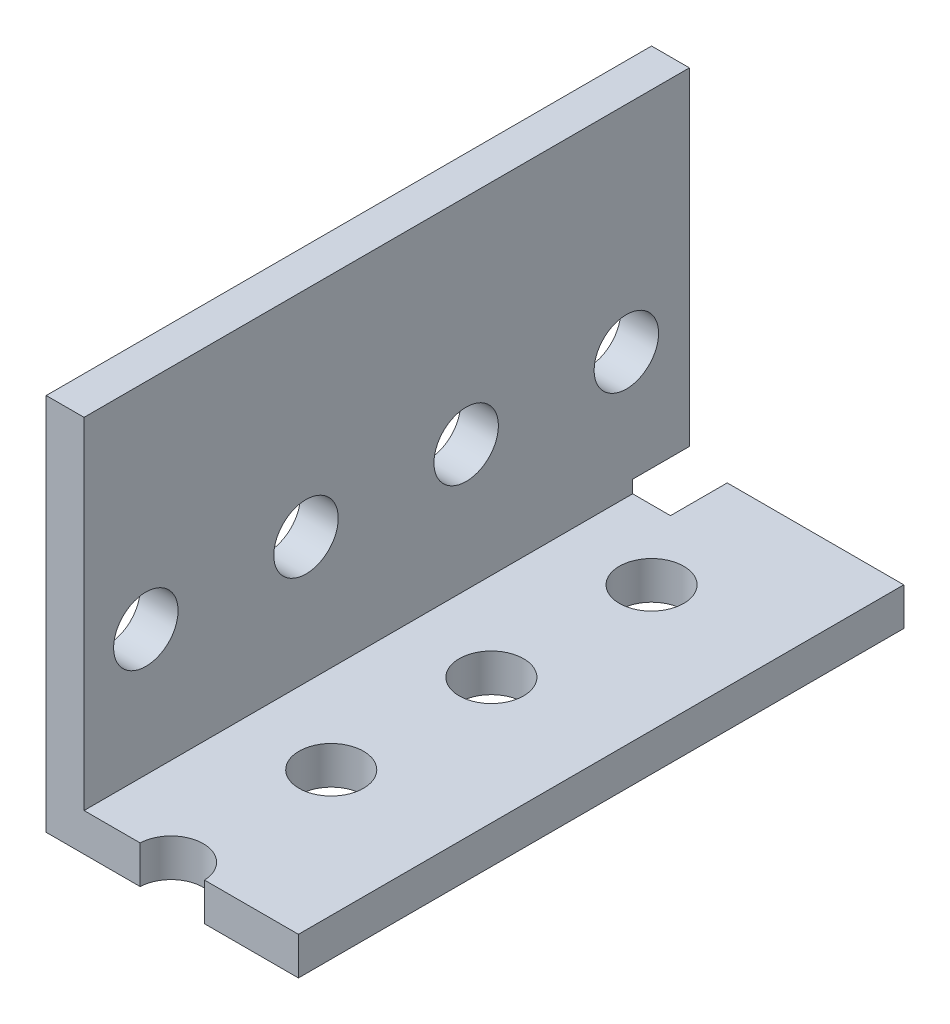
ISO-10303-21;
HEADER;
FILE_DESCRIPTION(('STEP AP214'),'2;1');
FILE_NAME('part.step','',(''),(''),'','','');
FILE_SCHEMA(('AUTOMOTIVE_DESIGN { 1 0 10303 214 1 1 1 1 }'));
ENDSEC;
DATA;
#1=APPLICATION_CONTEXT('core data for automotive mechanical design processes');
#2=APPLICATION_PROTOCOL_DEFINITION('international standard','automotive_design',2000,#1);
#3=PRODUCT_CONTEXT('',#1,'mechanical');
#4=PRODUCT('Part','Part','',(#3));
#5=PRODUCT_RELATED_PRODUCT_CATEGORY('part','',(#4));
#6=PRODUCT_DEFINITION_FORMATION('','',#4);
#7=PRODUCT_DEFINITION_CONTEXT('part definition',#1,'design');
#8=PRODUCT_DEFINITION('design','',#6,#7);
#9=PRODUCT_DEFINITION_SHAPE('','',#8);
#10=(LENGTH_UNIT() NAMED_UNIT(*) SI_UNIT(.MILLI.,.METRE.));
#11=(NAMED_UNIT(*) PLANE_ANGLE_UNIT() SI_UNIT($,.RADIAN.));
#12=(NAMED_UNIT(*) SI_UNIT($,.STERADIAN.) SOLID_ANGLE_UNIT());
#13=UNCERTAINTY_MEASURE_WITH_UNIT(LENGTH_MEASURE(1.E-05),#10,'distance_accuracy_value','');
#14=(GEOMETRIC_REPRESENTATION_CONTEXT(3) GLOBAL_UNCERTAINTY_ASSIGNED_CONTEXT((#13)) GLOBAL_UNIT_ASSIGNED_CONTEXT((#10,
#11,#12)) REPRESENTATION_CONTEXT('',''));
#15=CARTESIAN_POINT('',(0.,0.,0.));
#16=DIRECTION('',(0.,0.,1.));
#17=DIRECTION('',(1.,0.,0.));
#18=AXIS2_PLACEMENT_3D('',#15,#16,#17);
#19=CARTESIAN_POINT('',(0.,0.,0.));
#20=DIRECTION('',(0.,0.,1.));
#21=DIRECTION('',(1.,0.,0.));
#22=AXIS2_PLACEMENT_3D('',#19,#20,#21);
#23=PLANE('',#22);
#24=DIRECTION('',(1.,0.,0.));
#25=VECTOR('',#24,1.);
#26=CARTESIAN_POINT('',(0.,-15.,0.));
#27=LINE('',#26,#25);
#28=CARTESIAN_POINT('',(4.5,-15.,0.));
#29=VERTEX_POINT('',#28);
#30=CARTESIAN_POINT('',(18.5,-15.,0.));
#31=VERTEX_POINT('',#30);
#32=EDGE_CURVE('E221',#29,#31,#27,.T.);
#33=ORIENTED_EDGE('',*,*,#32,.F.);
#34=DIRECTION('',(0.,1.,0.));
#35=VECTOR('',#34,1.);
#36=CARTESIAN_POINT('',(4.5,0.,0.));
#37=LINE('',#36,#35);
#38=CARTESIAN_POINT('',(4.5,-12.,0.));
#39=VERTEX_POINT('',#38);
#40=EDGE_CURVE('E49',#29,#39,#37,.T.);
#41=ORIENTED_EDGE('',*,*,#40,.T.);
#42=DIRECTION('',(1.,0.,0.));
#43=VECTOR('',#42,1.);
#44=CARTESIAN_POINT('',(0.,-12.,0.));
#45=LINE('',#44,#43);
#46=CARTESIAN_POINT('',(18.5,-12.,0.));
#47=VERTEX_POINT('',#46);
#48=EDGE_CURVE('E226',#39,#47,#45,.T.);
#49=ORIENTED_EDGE('',*,*,#48,.T.);
#50=DIRECTION('',(0.,1.,0.));
#51=VECTOR('',#50,1.);
#52=CARTESIAN_POINT('',(18.5,0.,0.));
#53=LINE('',#52,#51);
#54=EDGE_CURVE('E223',#31,#47,#53,.T.);
#55=ORIENTED_EDGE('',*,*,#54,.F.);
#56=EDGE_LOOP('',(#33,#41,#49,#55));
#57=FACE_BOUND('',#56,.T.);
#58=ADVANCED_FACE('F41',(#57),#23,.F.);
#59=CARTESIAN_POINT('',(0.,0.,48.));
#60=DIRECTION('',(0.,0.,1.));
#61=DIRECTION('',(1.,0.,0.));
#62=AXIS2_PLACEMENT_3D('',#59,#60,#61);
#63=PLANE('',#62);
#64=DIRECTION('',(0.,1.,0.));
#65=VECTOR('',#64,1.);
#66=CARTESIAN_POINT('',(11.0530423028227,-15.,48.));
#67=LINE('',#66,#65);
#68=CARTESIAN_POINT('',(11.0530423028227,-15.,48.));
#69=VERTEX_POINT('',#68);
#70=CARTESIAN_POINT('',(11.0530423028227,-12.,48.));
#71=VERTEX_POINT('',#70);
#72=EDGE_CURVE('E249',#69,#71,#67,.T.);
#73=ORIENTED_EDGE('',*,*,#72,.F.);
#74=DIRECTION('',(1.,0.,0.));
#75=VECTOR('',#74,1.);
#76=CARTESIAN_POINT('',(0.,-15.,48.));
#77=LINE('',#76,#75);
#78=CARTESIAN_POINT('',(18.5,-15.,48.));
#79=VERTEX_POINT('',#78);
#80=EDGE_CURVE('E201',#69,#79,#77,.T.);
#81=ORIENTED_EDGE('',*,*,#80,.T.);
#82=DIRECTION('',(0.,1.,0.));
#83=VECTOR('',#82,1.);
#84=CARTESIAN_POINT('',(18.5,0.,48.));
#85=LINE('',#84,#83);
#86=CARTESIAN_POINT('',(18.5,-12.,48.));
#87=VERTEX_POINT('',#86);
#88=EDGE_CURVE('E206',#79,#87,#85,.T.);
#89=ORIENTED_EDGE('',*,*,#88,.T.);
#90=DIRECTION('',(1.,0.,0.));
#91=VECTOR('',#90,1.);
#92=CARTESIAN_POINT('',(0.,-12.,48.));
#93=LINE('',#92,#91);
#94=EDGE_CURVE('E209',#71,#87,#93,.T.);
#95=ORIENTED_EDGE('',*,*,#94,.F.);
#96=EDGE_LOOP('',(#73,#81,#89,#95));
#97=FACE_BOUND('',#96,.T.);
#98=ADVANCED_FACE('F300',(#97),#63,.T.);
#99=CARTESIAN_POINT('',(-1.5,0.,48.));
#100=DIRECTION('',(1.,0.,0.));
#101=DIRECTION('',(0.,1.,0.));
#102=AXIS2_PLACEMENT_3D('',#99,#100,#101);
#103=PLANE('',#102);
#104=CARTESIAN_POINT('',(-1.5,-2.,5.));
#105=DIRECTION('',(-1.,0.,0.));
#106=DIRECTION('',(0.,-1.,0.));
#107=AXIS2_PLACEMENT_3D('',#104,#105,#106);
#108=CIRCLE('',#107,2.555);
#109=CARTESIAN_POINT('',(-1.5,-4.555,5.));
#110=VERTEX_POINT('',#109);
#111=EDGE_CURVE('E163',#110,#110,#108,.T.);
#112=ORIENTED_EDGE('',*,*,#111,.F.);
#113=EDGE_LOOP('',(#112));
#114=FACE_BOUND('',#113,.T.);
#115=CARTESIAN_POINT('',(-1.5,-2.,17.7));
#116=DIRECTION('',(-1.,0.,0.));
#117=DIRECTION('',(0.,-1.,0.));
#118=AXIS2_PLACEMENT_3D('',#115,#116,#117);
#119=CIRCLE('',#118,2.555);
#120=CARTESIAN_POINT('',(-1.5,-4.555,17.7));
#121=VERTEX_POINT('',#120);
#122=EDGE_CURVE('E167',#121,#121,#119,.T.);
#123=ORIENTED_EDGE('',*,*,#122,.F.);
#124=EDGE_LOOP('',(#123));
#125=FACE_BOUND('',#124,.T.);
#126=CARTESIAN_POINT('',(-1.5,-2.,30.4));
#127=DIRECTION('',(-1.,0.,0.));
#128=DIRECTION('',(0.,-1.,0.));
#129=AXIS2_PLACEMENT_3D('',#126,#127,#128);
#130=CIRCLE('',#129,2.55500000000001);
#131=CARTESIAN_POINT('',(-1.5,-4.55500000000001,30.4));
#132=VERTEX_POINT('',#131);
#133=EDGE_CURVE('E170',#132,#132,#130,.T.);
#134=ORIENTED_EDGE('',*,*,#133,.F.);
#135=EDGE_LOOP('',(#134));
#136=FACE_BOUND('',#135,.T.);
#137=CARTESIAN_POINT('',(-1.5,-2.,43.1));
#138=DIRECTION('',(-1.,0.,0.));
#139=DIRECTION('',(0.,-1.,0.));
#140=AXIS2_PLACEMENT_3D('',#137,#138,#139);
#141=CIRCLE('',#140,2.555);
#142=CARTESIAN_POINT('',(-1.5,-4.555,43.1));
#143=VERTEX_POINT('',#142);
#144=EDGE_CURVE('E162',#143,#143,#141,.T.);
#145=ORIENTED_EDGE('',*,*,#144,.F.);
#146=EDGE_LOOP('',(#145));
#147=FACE_BOUND('',#146,.T.);
#148=DIRECTION('',(0.,-1.,0.));
#149=VECTOR('',#148,1.);
#150=CARTESIAN_POINT('',(-1.5,0.,0.));
#151=LINE('',#150,#149);
#152=CARTESIAN_POINT('',(-1.5,15.,0.));
#153=VERTEX_POINT('',#152);
#154=CARTESIAN_POINT('',(-1.5,-11.,0.));
#155=VERTEX_POINT('',#154);
#156=EDGE_CURVE('E148',#153,#155,#151,.T.);
#157=ORIENTED_EDGE('',*,*,#156,.T.);
#158=DIRECTION('',(0.,0.,-1.));
#159=VECTOR('',#158,1.);
#160=CARTESIAN_POINT('',(-1.5,-11.,4.5));
#161=LINE('',#160,#159);
#162=CARTESIAN_POINT('',(-1.5,-11.,4.5));
#163=VERTEX_POINT('',#162);
#164=EDGE_CURVE('E56',#163,#155,#161,.T.);
#165=ORIENTED_EDGE('',*,*,#164,.F.);
#166=DIRECTION('',(0.,1.,0.));
#167=VECTOR('',#166,1.);
#168=CARTESIAN_POINT('',(-1.5,-15.,4.5));
#169=LINE('',#168,#167);
#170=CARTESIAN_POINT('',(-1.5,-15.,4.5));
#171=VERTEX_POINT('',#170);
#172=EDGE_CURVE('E135',#171,#163,#169,.T.);
#173=ORIENTED_EDGE('',*,*,#172,.F.);
#174=DIRECTION('',(0.,0.,-1.));
#175=VECTOR('',#174,1.);
#176=CARTESIAN_POINT('',(-1.5,-15.,48.));
#177=LINE('',#176,#175);
#178=CARTESIAN_POINT('',(-1.5,-15.,48.));
#179=VERTEX_POINT('',#178);
#180=EDGE_CURVE('E245',#179,#171,#177,.T.);
#181=ORIENTED_EDGE('',*,*,#180,.F.);
#182=DIRECTION('',(0.,-1.,0.));
#183=VECTOR('',#182,1.);
#184=CARTESIAN_POINT('',(-1.5,0.,48.));
#185=LINE('',#184,#183);
#186=CARTESIAN_POINT('',(-1.5,15.,48.));
#187=VERTEX_POINT('',#186);
#188=EDGE_CURVE('E198',#187,#179,#185,.T.);
#189=ORIENTED_EDGE('',*,*,#188,.F.);
#190=DIRECTION('',(0.,0.,-1.));
#191=VECTOR('',#190,1.);
#192=CARTESIAN_POINT('',(-1.5,15.,48.));
#193=LINE('',#192,#191);
#194=EDGE_CURVE('E219',#187,#153,#193,.T.);
#195=ORIENTED_EDGE('',*,*,#194,.T.);
#196=EDGE_LOOP('',(#157,#165,#173,#181,#189,#195));
#197=FACE_BOUND('',#196,.T.);
#198=ADVANCED_FACE('F43',(#114,#125,#136,#147,#197),#103,.F.);
#199=CARTESIAN_POINT('',(0.,-15.,48.));
#200=DIRECTION('',(0.,1.,0.));
#201=DIRECTION('',(0.,0.,1.));
#202=AXIS2_PLACEMENT_3D('',#199,#200,#201);
#203=PLANE('',#202);
#204=CARTESIAN_POINT('',(8.5,-15.,10.));
#205=DIRECTION('',(0.,1.,0.));
#206=DIRECTION('',(0.,0.,1.));
#207=AXIS2_PLACEMENT_3D('',#204,#205,#206);
#208=CIRCLE('',#207,2.555);
#209=CARTESIAN_POINT('',(8.5,-15.,12.555));
#210=VERTEX_POINT('',#209);
#211=EDGE_CURVE('E175',#210,#210,#208,.T.);
#212=ORIENTED_EDGE('',*,*,#211,.T.);
#213=EDGE_LOOP('',(#212));
#214=FACE_BOUND('',#213,.T.);
#215=CARTESIAN_POINT('',(8.50000000000027,-15.,35.4));
#216=DIRECTION('',(0.,1.,0.));
#217=DIRECTION('',(0.,0.,1.));
#218=AXIS2_PLACEMENT_3D('',#215,#216,#217);
#219=CIRCLE('',#218,2.555);
#220=CARTESIAN_POINT('',(8.50000000000027,-15.,37.955));
#221=VERTEX_POINT('',#220);
#222=EDGE_CURVE('E185',#221,#221,#219,.T.);
#223=ORIENTED_EDGE('',*,*,#222,.T.);
#224=EDGE_LOOP('',(#223));
#225=FACE_BOUND('',#224,.T.);
#226=CARTESIAN_POINT('',(8.50000000000014,-15.,22.7));
#227=DIRECTION('',(0.,1.,0.));
#228=DIRECTION('',(0.,0.,1.));
#229=AXIS2_PLACEMENT_3D('',#226,#227,#228);
#230=CIRCLE('',#229,2.555);
#231=CARTESIAN_POINT('',(8.50000000000014,-15.,25.255));
#232=VERTEX_POINT('',#231);
#233=EDGE_CURVE('E184',#232,#232,#230,.T.);
#234=ORIENTED_EDGE('',*,*,#233,.T.);
#235=EDGE_LOOP('',(#234));
#236=FACE_BOUND('',#235,.T.);
#237=DIRECTION('',(-1.,0.,0.));
#238=VECTOR('',#237,1.);
#239=CARTESIAN_POINT('',(-1.5,-15.,4.5));
#240=LINE('',#239,#238);
#241=CARTESIAN_POINT('',(4.5,-15.,4.5));
#242=VERTEX_POINT('',#241);
#243=EDGE_CURVE('E140',#242,#171,#240,.T.);
#244=ORIENTED_EDGE('',*,*,#243,.F.);
#245=DIRECTION('',(0.,0.,-1.));
#246=VECTOR('',#245,1.);
#247=CARTESIAN_POINT('',(4.5,-15.,4.5));
#248=LINE('',#247,#246);
#249=EDGE_CURVE('E149',#242,#29,#248,.T.);
#250=ORIENTED_EDGE('',*,*,#249,.T.);
#251=ORIENTED_EDGE('',*,*,#32,.T.);
#252=DIRECTION('',(0.,0.,-1.));
#253=VECTOR('',#252,1.);
#254=CARTESIAN_POINT('',(18.5,-15.,48.));
#255=LINE('',#254,#253);
#256=EDGE_CURVE('E242',#79,#31,#255,.T.);
#257=ORIENTED_EDGE('',*,*,#256,.F.);
#258=ORIENTED_EDGE('',*,*,#80,.F.);
#259=CARTESIAN_POINT('',(8.5000000000004,-15.,48.1));
#260=DIRECTION('',(0.,1.,0.));
#261=DIRECTION('',(0.,0.,1.));
#262=AXIS2_PLACEMENT_3D('',#259,#260,#261);
#263=CIRCLE('',#262,2.555);
#264=CARTESIAN_POINT('',(5.94695769717814,-15.,48.));
#265=VERTEX_POINT('',#264);
#266=EDGE_CURVE('E190',#69,#265,#263,.T.);
#267=ORIENTED_EDGE('',*,*,#266,.T.);
#268=EDGE_CURVE('E203',#179,#265,#77,.T.);
#269=ORIENTED_EDGE('',*,*,#268,.F.);
#270=ORIENTED_EDGE('',*,*,#180,.T.);
#271=EDGE_LOOP('',(#244,#250,#251,#257,#258,#267,#269,#270));
#272=FACE_BOUND('',#271,.T.);
#273=ADVANCED_FACE('F279',(#214,#225,#236,#272),#203,.F.);
#274=CARTESIAN_POINT('',(18.5,0.,48.));
#275=DIRECTION('',(-1.,0.,0.));
#276=DIRECTION('',(0.,0.,1.));
#277=AXIS2_PLACEMENT_3D('',#274,#275,#276);
#278=PLANE('',#277);
#279=ORIENTED_EDGE('',*,*,#54,.T.);
#280=DIRECTION('',(0.,0.,-1.));
#281=VECTOR('',#280,1.);
#282=CARTESIAN_POINT('',(18.5,-12.,48.));
#283=LINE('',#282,#281);
#284=EDGE_CURVE('E239',#87,#47,#283,.T.);
#285=ORIENTED_EDGE('',*,*,#284,.F.);
#286=ORIENTED_EDGE('',*,*,#88,.F.);
#287=ORIENTED_EDGE('',*,*,#256,.T.);
#288=EDGE_LOOP('',(#279,#285,#286,#287));
#289=FACE_BOUND('',#288,.T.);
#290=ADVANCED_FACE('F275',(#289),#278,.F.);
#291=CARTESIAN_POINT('',(0.,-12.,48.));
#292=DIRECTION('',(0.,1.,0.));
#293=DIRECTION('',(0.,0.,1.));
#294=AXIS2_PLACEMENT_3D('',#291,#292,#293);
#295=PLANE('',#294);
#296=DIRECTION('',(0.,0.,-1.));
#297=VECTOR('',#296,1.);
#298=CARTESIAN_POINT('',(4.5,-12.,48.));
#299=LINE('',#298,#297);
#300=CARTESIAN_POINT('',(4.5,-12.,4.5));
#301=VERTEX_POINT('',#300);
#302=EDGE_CURVE('E157',#301,#39,#299,.T.);
#303=ORIENTED_EDGE('',*,*,#302,.F.);
#304=DIRECTION('',(-1.,0.,0.));
#305=VECTOR('',#304,1.);
#306=CARTESIAN_POINT('',(0.,-12.,4.5));
#307=LINE('',#306,#305);
#308=CARTESIAN_POINT('',(1.5,-12.,4.5));
#309=VERTEX_POINT('',#308);
#310=EDGE_CURVE('E159',#301,#309,#307,.T.);
#311=ORIENTED_EDGE('',*,*,#310,.T.);
#312=DIRECTION('',(0.,0.,-1.));
#313=VECTOR('',#312,1.);
#314=CARTESIAN_POINT('',(1.5,-12.,48.));
#315=LINE('',#314,#313);
#316=CARTESIAN_POINT('',(1.5,-12.,48.));
#317=VERTEX_POINT('',#316);
#318=EDGE_CURVE('E236',#317,#309,#315,.T.);
#319=ORIENTED_EDGE('',*,*,#318,.F.);
#320=CARTESIAN_POINT('',(5.94695769717814,-12.,48.));
#321=VERTEX_POINT('',#320);
#322=EDGE_CURVE('E210',#317,#321,#93,.T.);
#323=ORIENTED_EDGE('',*,*,#322,.T.);
#324=CARTESIAN_POINT('',(8.5000000000004,-12.,48.1));
#325=DIRECTION('',(0.,1.,0.));
#326=DIRECTION('',(0.,0.,1.));
#327=AXIS2_PLACEMENT_3D('',#324,#325,#326);
#328=CIRCLE('',#327,2.555);
#329=EDGE_CURVE('E64',#71,#321,#328,.T.);
#330=ORIENTED_EDGE('',*,*,#329,.F.);
#331=ORIENTED_EDGE('',*,*,#94,.T.);
#332=ORIENTED_EDGE('',*,*,#284,.T.);
#333=ORIENTED_EDGE('',*,*,#48,.F.);
#334=EDGE_LOOP('',(#303,#311,#319,#323,#330,#331,#332,#333));
#335=FACE_BOUND('',#334,.T.);
#336=CARTESIAN_POINT('',(8.5,-12.,10.));
#337=DIRECTION('',(0.,1.,0.));
#338=DIRECTION('',(0.,0.,1.));
#339=AXIS2_PLACEMENT_3D('',#336,#337,#338);
#340=CIRCLE('',#339,2.555);
#341=CARTESIAN_POINT('',(8.5,-12.,12.555));
#342=VERTEX_POINT('',#341);
#343=EDGE_CURVE('E178',#342,#342,#340,.T.);
#344=ORIENTED_EDGE('',*,*,#343,.F.);
#345=EDGE_LOOP('',(#344));
#346=FACE_BOUND('',#345,.T.);
#347=CARTESIAN_POINT('',(8.50000000000027,-12.,35.4));
#348=DIRECTION('',(0.,1.,0.));
#349=DIRECTION('',(0.,0.,1.));
#350=AXIS2_PLACEMENT_3D('',#347,#348,#349);
#351=CIRCLE('',#350,2.555);
#352=CARTESIAN_POINT('',(8.50000000000027,-12.,37.955));
#353=VERTEX_POINT('',#352);
#354=EDGE_CURVE('E181',#353,#353,#351,.T.);
#355=ORIENTED_EDGE('',*,*,#354,.F.);
#356=EDGE_LOOP('',(#355));
#357=FACE_BOUND('',#356,.T.);
#358=CARTESIAN_POINT('',(8.50000000000014,-12.,22.7));
#359=DIRECTION('',(0.,1.,0.));
#360=DIRECTION('',(0.,0.,1.));
#361=AXIS2_PLACEMENT_3D('',#358,#359,#360);
#362=CIRCLE('',#361,2.555);
#363=CARTESIAN_POINT('',(8.50000000000014,-12.,25.255));
#364=VERTEX_POINT('',#363);
#365=EDGE_CURVE('E193',#364,#364,#362,.T.);
#366=ORIENTED_EDGE('',*,*,#365,.F.);
#367=EDGE_LOOP('',(#366));
#368=FACE_BOUND('',#367,.T.);
#369=ADVANCED_FACE('F269',(#335,#346,#357,#368),#295,.T.);
#370=CARTESIAN_POINT('',(1.5,0.,48.));
#371=DIRECTION('',(1.,0.,0.));
#372=DIRECTION('',(0.,1.,0.));
#373=AXIS2_PLACEMENT_3D('',#370,#371,#372);
#374=PLANE('',#373);
#375=DIRECTION('',(0.,0.,1.));
#376=VECTOR('',#375,1.);
#377=CARTESIAN_POINT('',(1.5,-11.,48.));
#378=LINE('',#377,#376);
#379=CARTESIAN_POINT('',(1.5,-11.,0.));
#380=VERTEX_POINT('',#379);
#381=CARTESIAN_POINT('',(1.5,-11.,4.5));
#382=VERTEX_POINT('',#381);
#383=EDGE_CURVE('E132',#380,#382,#378,.T.);
#384=ORIENTED_EDGE('',*,*,#383,.F.);
#385=DIRECTION('',(0.,-1.,0.));
#386=VECTOR('',#385,1.);
#387=CARTESIAN_POINT('',(1.5,0.,0.));
#388=LINE('',#387,#386);
#389=CARTESIAN_POINT('',(1.5,15.,0.));
#390=VERTEX_POINT('',#389);
#391=EDGE_CURVE('E228',#390,#380,#388,.T.);
#392=ORIENTED_EDGE('',*,*,#391,.F.);
#393=DIRECTION('',(0.,0.,-1.));
#394=VECTOR('',#393,1.);
#395=CARTESIAN_POINT('',(1.5,15.,48.));
#396=LINE('',#395,#394);
#397=CARTESIAN_POINT('',(1.5,15.,48.));
#398=VERTEX_POINT('',#397);
#399=EDGE_CURVE('E234',#398,#390,#396,.T.);
#400=ORIENTED_EDGE('',*,*,#399,.F.);
#401=DIRECTION('',(0.,-1.,0.));
#402=VECTOR('',#401,1.);
#403=CARTESIAN_POINT('',(1.5,0.,48.));
#404=LINE('',#403,#402);
#405=EDGE_CURVE('E213',#398,#317,#404,.T.);
#406=ORIENTED_EDGE('',*,*,#405,.T.);
#407=ORIENTED_EDGE('',*,*,#318,.T.);
#408=DIRECTION('',(0.,1.,0.));
#409=VECTOR('',#408,1.);
#410=CARTESIAN_POINT('',(1.5,0.,4.5));
#411=LINE('',#410,#409);
#412=EDGE_CURVE('E11',#309,#382,#411,.T.);
#413=ORIENTED_EDGE('',*,*,#412,.T.);
#414=EDGE_LOOP('',(#384,#392,#400,#406,#407,#413));
#415=FACE_BOUND('',#414,.T.);
#416=CARTESIAN_POINT('',(1.5,-2.,5.));
#417=DIRECTION('',(1.,0.,0.));
#418=DIRECTION('',(0.,1.,0.));
#419=AXIS2_PLACEMENT_3D('',#416,#417,#418);
#420=CIRCLE('',#419,2.555);
#421=CARTESIAN_POINT('',(1.5,0.554999999999994,5.));
#422=VERTEX_POINT('',#421);
#423=EDGE_CURVE('E188',#422,#422,#420,.T.);
#424=ORIENTED_EDGE('',*,*,#423,.F.);
#425=EDGE_LOOP('',(#424));
#426=FACE_BOUND('',#425,.T.);
#427=CARTESIAN_POINT('',(1.5,-2.,17.7));
#428=DIRECTION('',(1.,0.,0.));
#429=DIRECTION('',(0.,1.,0.));
#430=AXIS2_PLACEMENT_3D('',#427,#428,#429);
#431=CIRCLE('',#430,2.555);
#432=CARTESIAN_POINT('',(1.5,0.554999999999996,17.7));
#433=VERTEX_POINT('',#432);
#434=EDGE_CURVE('E256',#433,#433,#431,.T.);
#435=ORIENTED_EDGE('',*,*,#434,.F.);
#436=EDGE_LOOP('',(#435));
#437=FACE_BOUND('',#436,.T.);
#438=CARTESIAN_POINT('',(1.5,-2.,30.4));
#439=DIRECTION('',(1.,0.,0.));
#440=DIRECTION('',(0.,1.,0.));
#441=AXIS2_PLACEMENT_3D('',#438,#439,#440);
#442=CIRCLE('',#441,2.55500000000001);
#443=CARTESIAN_POINT('',(1.5,0.555000000000006,30.4));
#444=VERTEX_POINT('',#443);
#445=EDGE_CURVE('E253',#444,#444,#442,.T.);
#446=ORIENTED_EDGE('',*,*,#445,.F.);
#447=EDGE_LOOP('',(#446));
#448=FACE_BOUND('',#447,.T.);
#449=CARTESIAN_POINT('',(1.5,-2.,43.1));
#450=DIRECTION('',(1.,0.,0.));
#451=DIRECTION('',(0.,1.,0.));
#452=AXIS2_PLACEMENT_3D('',#449,#450,#451);
#453=CIRCLE('',#452,2.555);
#454=CARTESIAN_POINT('',(1.5,0.554999999999996,43.1));
#455=VERTEX_POINT('',#454);
#456=EDGE_CURVE('E166',#455,#455,#453,.T.);
#457=ORIENTED_EDGE('',*,*,#456,.F.);
#458=EDGE_LOOP('',(#457));
#459=FACE_BOUND('',#458,.T.);
#460=ADVANCED_FACE('F286',(#415,#426,#437,#448,#459),#374,.T.);
#461=CARTESIAN_POINT('',(0.,15.,48.));
#462=DIRECTION('',(0.,1.,0.));
#463=DIRECTION('',(0.,0.,1.));
#464=AXIS2_PLACEMENT_3D('',#461,#462,#463);
#465=PLANE('',#464);
#466=DIRECTION('',(1.,0.,0.));
#467=VECTOR('',#466,1.);
#468=CARTESIAN_POINT('',(0.,15.,0.));
#469=LINE('',#468,#467);
#470=EDGE_CURVE('E202',#153,#390,#469,.T.);
#471=ORIENTED_EDGE('',*,*,#470,.F.);
#472=ORIENTED_EDGE('',*,*,#194,.F.);
#473=DIRECTION('',(1.,0.,0.));
#474=VECTOR('',#473,1.);
#475=CARTESIAN_POINT('',(0.,15.,48.));
#476=LINE('',#475,#474);
#477=EDGE_CURVE('E216',#187,#398,#476,.T.);
#478=ORIENTED_EDGE('',*,*,#477,.T.);
#479=ORIENTED_EDGE('',*,*,#399,.T.);
#480=EDGE_LOOP('',(#471,#472,#478,#479));
#481=FACE_BOUND('',#480,.T.);
#482=ADVANCED_FACE('F291',(#481),#465,.T.);
#483=DIRECTION('',(0.,1.,0.));
#484=VECTOR('',#483,1.);
#485=CARTESIAN_POINT('',(5.94695769717814,-15.,48.));
#486=LINE('',#485,#484);
#487=EDGE_CURVE('E247',#321,#265,#486,.F.);
#488=ORIENTED_EDGE('',*,*,#487,.F.);
#489=ORIENTED_EDGE('',*,*,#322,.F.);
#490=ORIENTED_EDGE('',*,*,#405,.F.);
#491=ORIENTED_EDGE('',*,*,#477,.F.);
#492=ORIENTED_EDGE('',*,*,#188,.T.);
#493=ORIENTED_EDGE('',*,*,#268,.T.);
#494=EDGE_LOOP('',(#488,#489,#490,#491,#492,#493));
#495=FACE_BOUND('',#494,.T.);
#496=ADVANCED_FACE('F297',(#495),#63,.T.);
#497=ORIENTED_EDGE('',*,*,#391,.T.);
#498=DIRECTION('',(1.,0.,0.));
#499=VECTOR('',#498,1.);
#500=CARTESIAN_POINT('',(-1.5,-11.,0.));
#501=LINE('',#500,#499);
#502=EDGE_CURVE('E144',#155,#380,#501,.T.);
#503=ORIENTED_EDGE('',*,*,#502,.F.);
#504=ORIENTED_EDGE('',*,*,#156,.F.);
#505=ORIENTED_EDGE('',*,*,#470,.T.);
#506=EDGE_LOOP('',(#497,#503,#504,#505));
#507=FACE_BOUND('',#506,.T.);
#508=ADVANCED_FACE('F288',(#507),#23,.F.);
#509=CARTESIAN_POINT('',(8.5000000000004,-15.,48.1));
#510=DIRECTION('',(0.,1.,0.));
#511=DIRECTION('',(0.,0.,1.));
#512=AXIS2_PLACEMENT_3D('',#509,#510,#511);
#513=CYLINDRICAL_SURFACE('',#512,2.555);
#514=ORIENTED_EDGE('',*,*,#72,.T.);
#515=ORIENTED_EDGE('',*,*,#329,.T.);
#516=ORIENTED_EDGE('',*,*,#487,.T.);
#517=ORIENTED_EDGE('',*,*,#266,.F.);
#518=EDGE_LOOP('',(#514,#515,#516,#517));
#519=FACE_BOUND('',#518,.T.);
#520=ADVANCED_FACE('F301',(#519),#513,.F.);
#521=CARTESIAN_POINT('',(8.50000000000014,-15.,22.7));
#522=DIRECTION('',(0.,1.,0.));
#523=DIRECTION('',(0.,0.,1.));
#524=AXIS2_PLACEMENT_3D('',#521,#522,#523);
#525=CYLINDRICAL_SURFACE('',#524,2.555);
#526=ORIENTED_EDGE('',*,*,#233,.F.);
#527=EDGE_LOOP('',(#526));
#528=FACE_BOUND('',#527,.T.);
#529=ORIENTED_EDGE('',*,*,#365,.T.);
#530=EDGE_LOOP('',(#529));
#531=FACE_BOUND('',#530,.T.);
#532=ADVANCED_FACE('F303',(#528,#531),#525,.F.);
#533=CARTESIAN_POINT('',(8.50000000000027,-15.,35.4));
#534=DIRECTION('',(0.,1.,0.));
#535=DIRECTION('',(0.,0.,1.));
#536=AXIS2_PLACEMENT_3D('',#533,#534,#535);
#537=CYLINDRICAL_SURFACE('',#536,2.555);
#538=ORIENTED_EDGE('',*,*,#222,.F.);
#539=EDGE_LOOP('',(#538));
#540=FACE_BOUND('',#539,.T.);
#541=ORIENTED_EDGE('',*,*,#354,.T.);
#542=EDGE_LOOP('',(#541));
#543=FACE_BOUND('',#542,.T.);
#544=ADVANCED_FACE('F309',(#540,#543),#537,.F.);
#545=CARTESIAN_POINT('',(8.5,-15.,10.));
#546=DIRECTION('',(0.,1.,0.));
#547=DIRECTION('',(0.,0.,1.));
#548=AXIS2_PLACEMENT_3D('',#545,#546,#547);
#549=CYLINDRICAL_SURFACE('',#548,2.555);
#550=ORIENTED_EDGE('',*,*,#211,.F.);
#551=EDGE_LOOP('',(#550));
#552=FACE_BOUND('',#551,.T.);
#553=ORIENTED_EDGE('',*,*,#343,.T.);
#554=EDGE_LOOP('',(#553));
#555=FACE_BOUND('',#554,.T.);
#556=ADVANCED_FACE('F346',(#552,#555),#549,.F.);
#557=CARTESIAN_POINT('',(18.5,-2.,43.1));
#558=DIRECTION('',(-1.,0.,0.));
#559=DIRECTION('',(0.,-1.,0.));
#560=AXIS2_PLACEMENT_3D('',#557,#558,#559);
#561=CYLINDRICAL_SURFACE('',#560,2.555);
#562=ORIENTED_EDGE('',*,*,#456,.T.);
#563=EDGE_LOOP('',(#562));
#564=FACE_BOUND('',#563,.T.);
#565=ORIENTED_EDGE('',*,*,#144,.T.);
#566=EDGE_LOOP('',(#565));
#567=FACE_BOUND('',#566,.T.);
#568=ADVANCED_FACE('F352',(#564,#567),#561,.F.);
#569=CARTESIAN_POINT('',(18.5,-2.,30.4));
#570=DIRECTION('',(-1.,0.,0.));
#571=DIRECTION('',(0.,-1.,0.));
#572=AXIS2_PLACEMENT_3D('',#569,#570,#571);
#573=CYLINDRICAL_SURFACE('',#572,2.55500000000001);
#574=ORIENTED_EDGE('',*,*,#445,.T.);
#575=EDGE_LOOP('',(#574));
#576=FACE_BOUND('',#575,.T.);
#577=ORIENTED_EDGE('',*,*,#133,.T.);
#578=EDGE_LOOP('',(#577));
#579=FACE_BOUND('',#578,.T.);
#580=ADVANCED_FACE('F358',(#576,#579),#573,.F.);
#581=CARTESIAN_POINT('',(18.5,-2.,17.7));
#582=DIRECTION('',(-1.,0.,0.));
#583=DIRECTION('',(0.,-1.,0.));
#584=AXIS2_PLACEMENT_3D('',#581,#582,#583);
#585=CYLINDRICAL_SURFACE('',#584,2.555);
#586=ORIENTED_EDGE('',*,*,#434,.T.);
#587=EDGE_LOOP('',(#586));
#588=FACE_BOUND('',#587,.T.);
#589=ORIENTED_EDGE('',*,*,#122,.T.);
#590=EDGE_LOOP('',(#589));
#591=FACE_BOUND('',#590,.T.);
#592=ADVANCED_FACE('F362',(#588,#591),#585,.F.);
#593=CARTESIAN_POINT('',(18.5,-2.,5.));
#594=DIRECTION('',(-1.,0.,0.));
#595=DIRECTION('',(0.,-1.,0.));
#596=AXIS2_PLACEMENT_3D('',#593,#594,#595);
#597=CYLINDRICAL_SURFACE('',#596,2.555);
#598=ORIENTED_EDGE('',*,*,#423,.T.);
#599=EDGE_LOOP('',(#598));
#600=FACE_BOUND('',#599,.T.);
#601=ORIENTED_EDGE('',*,*,#111,.T.);
#602=EDGE_LOOP('',(#601));
#603=FACE_BOUND('',#602,.T.);
#604=ADVANCED_FACE('F366',(#600,#603),#597,.F.);
#605=CARTESIAN_POINT('',(4.5,-15.,4.5));
#606=DIRECTION('',(1.,0.,0.));
#607=DIRECTION('',(0.,0.,-1.));
#608=AXIS2_PLACEMENT_3D('',#605,#606,#607);
#609=PLANE('',#608);
#610=ORIENTED_EDGE('',*,*,#302,.T.);
#611=ORIENTED_EDGE('',*,*,#40,.F.);
#612=ORIENTED_EDGE('',*,*,#249,.F.);
#613=DIRECTION('',(0.,-1.,0.));
#614=VECTOR('',#613,1.);
#615=CARTESIAN_POINT('',(4.5,-15.,4.5));
#616=LINE('',#615,#614);
#617=EDGE_CURVE('E134',#301,#242,#616,.T.);
#618=ORIENTED_EDGE('',*,*,#617,.F.);
#619=EDGE_LOOP('',(#610,#611,#612,#618));
#620=FACE_BOUND('',#619,.T.);
#621=ADVANCED_FACE('F281',(#620),#609,.F.);
#622=CARTESIAN_POINT('',(-1.5,-11.,4.5));
#623=DIRECTION('',(0.,1.,0.));
#624=DIRECTION('',(0.,0.,1.));
#625=AXIS2_PLACEMENT_3D('',#622,#623,#624);
#626=PLANE('',#625);
#627=ORIENTED_EDGE('',*,*,#383,.T.);
#628=DIRECTION('',(1.,0.,0.));
#629=VECTOR('',#628,1.);
#630=CARTESIAN_POINT('',(-1.5,-11.,4.5));
#631=LINE('',#630,#629);
#632=EDGE_CURVE('E128',#163,#382,#631,.T.);
#633=ORIENTED_EDGE('',*,*,#632,.F.);
#634=ORIENTED_EDGE('',*,*,#164,.T.);
#635=ORIENTED_EDGE('',*,*,#502,.T.);
#636=EDGE_LOOP('',(#627,#633,#634,#635));
#637=FACE_BOUND('',#636,.T.);
#638=ADVANCED_FACE('F130',(#637),#626,.F.);
#639=CARTESIAN_POINT('',(0.,0.,4.5));
#640=DIRECTION('',(0.,0.,-1.));
#641=DIRECTION('',(-1.,0.,0.));
#642=AXIS2_PLACEMENT_3D('',#639,#640,#641);
#643=PLANE('',#642);
#644=ORIENTED_EDGE('',*,*,#617,.T.);
#645=ORIENTED_EDGE('',*,*,#243,.T.);
#646=ORIENTED_EDGE('',*,*,#172,.T.);
#647=ORIENTED_EDGE('',*,*,#632,.T.);
#648=ORIENTED_EDGE('',*,*,#412,.F.);
#649=ORIENTED_EDGE('',*,*,#310,.F.);
#650=EDGE_LOOP('',(#644,#645,#646,#647,#648,#649));
#651=FACE_BOUND('',#650,.T.);
#652=ADVANCED_FACE('F138',(#651),#643,.T.);
#653=CLOSED_SHELL('',(#58,#98,#198,#273,#290,#369,#460,#482,#496,#508,#520,#532,#544,#556,#568,
#580,#592,#604,#621,#638,#652));
#654=MANIFOLD_SOLID_BREP('B2',#653);
#655=ADVANCED_BREP_SHAPE_REPRESENTATION('',(#18,#654),#14);
#656=SHAPE_DEFINITION_REPRESENTATION(#9,#655);
ENDSEC;
END-ISO-10303-21;
